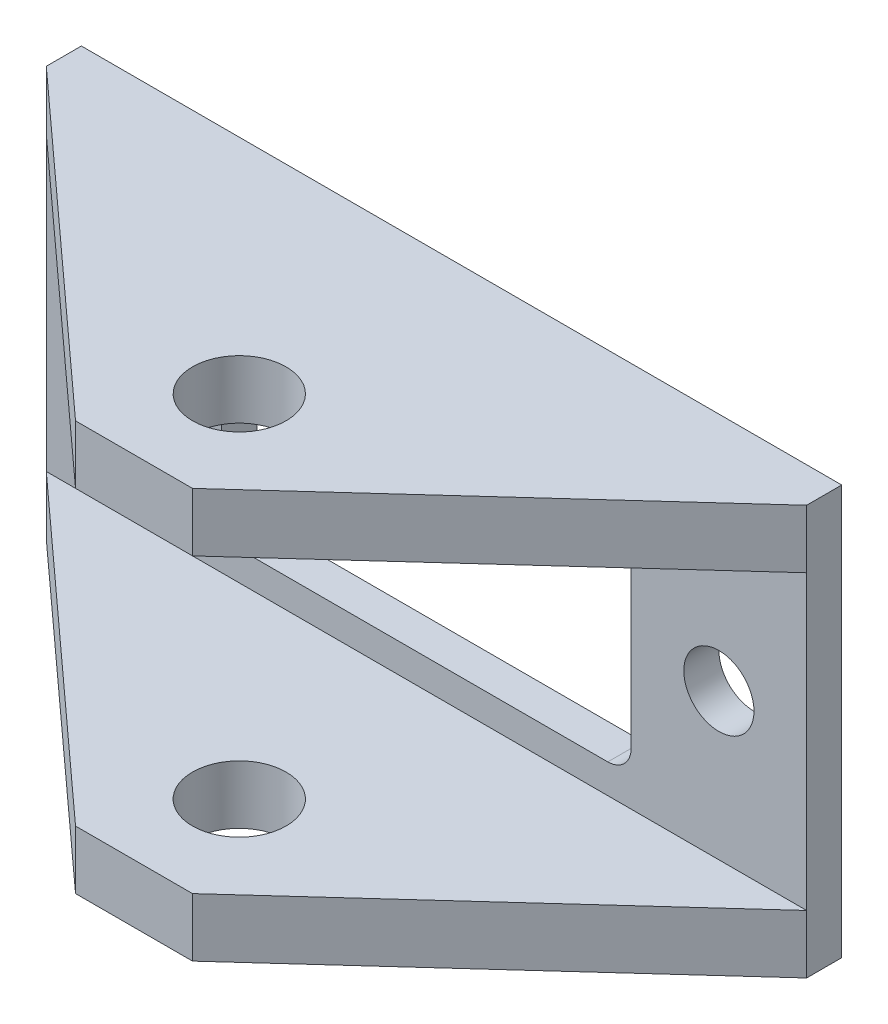
ISO-10303-21;
HEADER;
FILE_DESCRIPTION(('STEP AP214'),'2;1');
FILE_NAME('part.step','',(''),(''),'','','');
FILE_SCHEMA(('AUTOMOTIVE_DESIGN { 1 0 10303 214 1 1 1 1 }'));
ENDSEC;
DATA;
#1=APPLICATION_CONTEXT('core data for automotive mechanical design processes');
#2=APPLICATION_PROTOCOL_DEFINITION('international standard','automotive_design',2000,#1);
#3=PRODUCT_CONTEXT('',#1,'mechanical');
#4=PRODUCT('Part','Part','',(#3));
#5=PRODUCT_RELATED_PRODUCT_CATEGORY('part','',(#4));
#6=PRODUCT_DEFINITION_FORMATION('','',#4);
#7=PRODUCT_DEFINITION_CONTEXT('part definition',#1,'design');
#8=PRODUCT_DEFINITION('design','',#6,#7);
#9=PRODUCT_DEFINITION_SHAPE('','',#8);
#10=(LENGTH_UNIT() NAMED_UNIT(*) SI_UNIT(.MILLI.,.METRE.));
#11=(NAMED_UNIT(*) PLANE_ANGLE_UNIT() SI_UNIT($,.RADIAN.));
#12=(NAMED_UNIT(*) SI_UNIT($,.STERADIAN.) SOLID_ANGLE_UNIT());
#13=UNCERTAINTY_MEASURE_WITH_UNIT(LENGTH_MEASURE(1.E-05),#10,'distance_accuracy_value','');
#14=(GEOMETRIC_REPRESENTATION_CONTEXT(3) GLOBAL_UNCERTAINTY_ASSIGNED_CONTEXT((#13)) GLOBAL_UNIT_ASSIGNED_CONTEXT((#10,
#11,#12)) REPRESENTATION_CONTEXT('',''));
#15=CARTESIAN_POINT('',(0.,0.,0.));
#16=DIRECTION('',(0.,0.,1.));
#17=DIRECTION('',(1.,0.,0.));
#18=AXIS2_PLACEMENT_3D('',#15,#16,#17);
#19=CARTESIAN_POINT('',(0.,35.,-12.5));
#20=DIRECTION('',(0.,0.,-1.));
#21=DIRECTION('',(-1.,0.,0.));
#22=AXIS2_PLACEMENT_3D('',#19,#20,#21);
#23=PLANE('',#22);
#24=CARTESIAN_POINT('',(-25.,17.5,-12.5));
#25=DIRECTION('',(0.,0.,1.));
#26=DIRECTION('',(1.,0.,0.));
#27=AXIS2_PLACEMENT_3D('',#24,#25,#26);
#28=CIRCLE('',#27,3.);
#29=CARTESIAN_POINT('',(-22.,17.5,-12.5));
#30=VERTEX_POINT('',#29);
#31=EDGE_CURVE('E609',#30,#30,#28,.T.);
#32=ORIENTED_EDGE('',*,*,#31,.T.);
#33=EDGE_LOOP('',(#32));
#34=FACE_BOUND('',#33,.T.);
#35=CARTESIAN_POINT('',(25.,17.5,-12.5));
#36=DIRECTION('',(0.,0.,1.));
#37=DIRECTION('',(1.,0.,0.));
#38=AXIS2_PLACEMENT_3D('',#35,#36,#37);
#39=CIRCLE('',#38,3.);
#40=CARTESIAN_POINT('',(28.,17.5,-12.5));
#41=VERTEX_POINT('',#40);
#42=EDGE_CURVE('E608',#41,#41,#39,.T.);
#43=ORIENTED_EDGE('',*,*,#42,.T.);
#44=EDGE_LOOP('',(#43));
#45=FACE_BOUND('',#44,.T.);
#46=DIRECTION('',(1.,0.,0.));
#47=VECTOR('',#46,1.);
#48=CARTESIAN_POINT('',(0.,0.,-12.5));
#49=LINE('',#48,#47);
#50=CARTESIAN_POINT('',(-32.5,0.,-12.5));
#51=VERTEX_POINT('',#50);
#52=CARTESIAN_POINT('',(32.5,0.,-12.5));
#53=VERTEX_POINT('',#52);
#54=EDGE_CURVE('E381',#51,#53,#49,.T.);
#55=ORIENTED_EDGE('',*,*,#54,.F.);
#56=DIRECTION('',(0.,-1.,0.));
#57=VECTOR('',#56,1.);
#58=CARTESIAN_POINT('',(-32.5,35.,-12.5));
#59=LINE('',#58,#57);
#60=CARTESIAN_POINT('',(-32.5,35.,-12.5));
#61=VERTEX_POINT('',#60);
#62=EDGE_CURVE('E388',#61,#51,#59,.T.);
#63=ORIENTED_EDGE('',*,*,#62,.F.);
#64=DIRECTION('',(1.,0.,0.));
#65=VECTOR('',#64,1.);
#66=CARTESIAN_POINT('',(0.,35.,-12.5));
#67=LINE('',#66,#65);
#68=CARTESIAN_POINT('',(32.5,35.,-12.5));
#69=VERTEX_POINT('',#68);
#70=EDGE_CURVE('E364',#61,#69,#67,.T.);
#71=ORIENTED_EDGE('',*,*,#70,.T.);
#72=DIRECTION('',(0.,-1.,0.));
#73=VECTOR('',#72,1.);
#74=CARTESIAN_POINT('',(32.5,35.,-12.5));
#75=LINE('',#74,#73);
#76=EDGE_CURVE('E204',#69,#53,#75,.T.);
#77=ORIENTED_EDGE('',*,*,#76,.T.);
#78=EDGE_LOOP('',(#55,#63,#71,#77));
#79=FACE_BOUND('',#78,.T.);
#80=DIRECTION('',(0.,-1.,0.));
#81=VECTOR('',#80,1.);
#82=CARTESIAN_POINT('',(-17.5,0.,-12.5));
#83=LINE('',#82,#81);
#84=CARTESIAN_POINT('',(-17.5,25.5,-12.5));
#85=VERTEX_POINT('',#84);
#86=CARTESIAN_POINT('',(-17.5,9.5,-12.5));
#87=VERTEX_POINT('',#86);
#88=EDGE_CURVE('E279',#85,#87,#83,.T.);
#89=ORIENTED_EDGE('',*,*,#88,.T.);
#90=CARTESIAN_POINT('',(-15.5,9.5,-12.5));
#91=DIRECTION('',(0.,0.,-1.));
#92=DIRECTION('',(-1.,0.,0.));
#93=AXIS2_PLACEMENT_3D('',#90,#91,#92);
#94=CIRCLE('',#93,2.);
#95=CARTESIAN_POINT('',(-15.5,7.5,-12.5));
#96=VERTEX_POINT('',#95);
#97=EDGE_CURVE('E258',#87,#96,#94,.F.);
#98=ORIENTED_EDGE('',*,*,#97,.T.);
#99=DIRECTION('',(1.,0.,0.));
#100=VECTOR('',#99,1.);
#101=CARTESIAN_POINT('',(0.,7.5,-12.5));
#102=LINE('',#101,#100);
#103=CARTESIAN_POINT('',(15.5,7.5,-12.5));
#104=VERTEX_POINT('',#103);
#105=EDGE_CURVE('E229',#96,#104,#102,.T.);
#106=ORIENTED_EDGE('',*,*,#105,.T.);
#107=CARTESIAN_POINT('',(15.5,9.5,-12.5));
#108=DIRECTION('',(0.,0.,-1.));
#109=DIRECTION('',(-1.,0.,0.));
#110=AXIS2_PLACEMENT_3D('',#107,#108,#109);
#111=CIRCLE('',#110,2.);
#112=CARTESIAN_POINT('',(17.5,9.5,-12.5));
#113=VERTEX_POINT('',#112);
#114=EDGE_CURVE('E262',#104,#113,#111,.F.);
#115=ORIENTED_EDGE('',*,*,#114,.T.);
#116=DIRECTION('',(0.,-1.,0.));
#117=VECTOR('',#116,1.);
#118=CARTESIAN_POINT('',(17.5,0.,-12.5));
#119=LINE('',#118,#117);
#120=CARTESIAN_POINT('',(17.5,25.5,-12.5));
#121=VERTEX_POINT('',#120);
#122=EDGE_CURVE('E275',#121,#113,#119,.T.);
#123=ORIENTED_EDGE('',*,*,#122,.F.);
#124=CARTESIAN_POINT('',(15.5,25.5,-12.5));
#125=DIRECTION('',(0.,0.,-1.));
#126=DIRECTION('',(-1.,0.,0.));
#127=AXIS2_PLACEMENT_3D('',#124,#125,#126);
#128=CIRCLE('',#127,2.);
#129=CARTESIAN_POINT('',(15.5,27.5,-12.5));
#130=VERTEX_POINT('',#129);
#131=EDGE_CURVE('E265',#121,#130,#128,.F.);
#132=ORIENTED_EDGE('',*,*,#131,.T.);
#133=DIRECTION('',(1.,0.,0.));
#134=VECTOR('',#133,1.);
#135=CARTESIAN_POINT('',(0.,27.5,-12.5));
#136=LINE('',#135,#134);
#137=CARTESIAN_POINT('',(-15.5,27.5,-12.5));
#138=VERTEX_POINT('',#137);
#139=EDGE_CURVE('E272',#138,#130,#136,.T.);
#140=ORIENTED_EDGE('',*,*,#139,.F.);
#141=CARTESIAN_POINT('',(-15.5,25.5,-12.5));
#142=DIRECTION('',(0.,0.,-1.));
#143=DIRECTION('',(-1.,0.,0.));
#144=AXIS2_PLACEMENT_3D('',#141,#142,#143);
#145=CIRCLE('',#144,2.);
#146=EDGE_CURVE('E11',#138,#85,#145,.F.);
#147=ORIENTED_EDGE('',*,*,#146,.T.);
#148=EDGE_LOOP('',(#89,#98,#106,#115,#123,#132,#140,#147));
#149=FACE_BOUND('',#148,.T.);
#150=ADVANCED_FACE('F37',(#34,#45,#79,#149),#23,.T.);
#151=CARTESIAN_POINT('',(0.,0.,-9.5));
#152=DIRECTION('',(0.,0.,1.));
#153=DIRECTION('',(1.,0.,0.));
#154=AXIS2_PLACEMENT_3D('',#151,#152,#153);
#155=PLANE('',#154);
#156=CARTESIAN_POINT('',(-25.,17.5,-9.5));
#157=DIRECTION('',(0.,0.,1.));
#158=DIRECTION('',(1.,0.,0.));
#159=AXIS2_PLACEMENT_3D('',#156,#157,#158);
#160=CIRCLE('',#159,3.);
#161=CARTESIAN_POINT('',(-22.,17.5,-9.5));
#162=VERTEX_POINT('',#161);
#163=EDGE_CURVE('E228',#162,#162,#160,.T.);
#164=ORIENTED_EDGE('',*,*,#163,.F.);
#165=EDGE_LOOP('',(#164));
#166=FACE_BOUND('',#165,.T.);
#167=CARTESIAN_POINT('',(25.,17.5,-9.5));
#168=DIRECTION('',(0.,0.,1.));
#169=DIRECTION('',(1.,0.,0.));
#170=AXIS2_PLACEMENT_3D('',#167,#168,#169);
#171=CIRCLE('',#170,3.);
#172=CARTESIAN_POINT('',(28.,17.5,-9.5));
#173=VERTEX_POINT('',#172);
#174=EDGE_CURVE('E225',#173,#173,#171,.T.);
#175=ORIENTED_EDGE('',*,*,#174,.F.);
#176=EDGE_LOOP('',(#175));
#177=FACE_BOUND('',#176,.T.);
#178=DIRECTION('',(0.,-1.,0.));
#179=VECTOR('',#178,1.);
#180=CARTESIAN_POINT('',(32.5,0.,-9.5));
#181=LINE('',#180,#179);
#182=CARTESIAN_POINT('',(32.5,30.,-9.5));
#183=VERTEX_POINT('',#182);
#184=CARTESIAN_POINT('',(32.5,5.,-9.5));
#185=VERTEX_POINT('',#184);
#186=EDGE_CURVE('E172',#183,#185,#181,.T.);
#187=ORIENTED_EDGE('',*,*,#186,.F.);
#188=DIRECTION('',(1.,0.,0.));
#189=VECTOR('',#188,1.);
#190=CARTESIAN_POINT('',(0.,30.,-9.5));
#191=LINE('',#190,#189);
#192=CARTESIAN_POINT('',(-32.5,30.,-9.5));
#193=VERTEX_POINT('',#192);
#194=EDGE_CURVE('E161',#193,#183,#191,.T.);
#195=ORIENTED_EDGE('',*,*,#194,.F.);
#196=DIRECTION('',(0.,-1.,0.));
#197=VECTOR('',#196,1.);
#198=CARTESIAN_POINT('',(-32.5,0.,-9.5));
#199=LINE('',#198,#197);
#200=CARTESIAN_POINT('',(-32.5,5.,-9.5));
#201=VERTEX_POINT('',#200);
#202=EDGE_CURVE('E171',#193,#201,#199,.T.);
#203=ORIENTED_EDGE('',*,*,#202,.T.);
#204=DIRECTION('',(1.,0.,0.));
#205=VECTOR('',#204,1.);
#206=CARTESIAN_POINT('',(0.,5.,-9.5));
#207=LINE('',#206,#205);
#208=EDGE_CURVE('E178',#201,#185,#207,.T.);
#209=ORIENTED_EDGE('',*,*,#208,.T.);
#210=EDGE_LOOP('',(#187,#195,#203,#209));
#211=FACE_BOUND('',#210,.T.);
#212=DIRECTION('',(0.,-1.,0.));
#213=VECTOR('',#212,1.);
#214=CARTESIAN_POINT('',(-17.5,0.,-9.5));
#215=LINE('',#214,#213);
#216=CARTESIAN_POINT('',(-17.5,25.5,-9.5));
#217=VERTEX_POINT('',#216);
#218=CARTESIAN_POINT('',(-17.5,9.5,-9.5));
#219=VERTEX_POINT('',#218);
#220=EDGE_CURVE('E215',#217,#219,#215,.T.);
#221=ORIENTED_EDGE('',*,*,#220,.F.);
#222=CARTESIAN_POINT('',(-15.5,25.5,-9.5));
#223=DIRECTION('',(0.,0.,1.));
#224=DIRECTION('',(1.,0.,0.));
#225=AXIS2_PLACEMENT_3D('',#222,#223,#224);
#226=CIRCLE('',#225,2.);
#227=CARTESIAN_POINT('',(-15.5,27.5,-9.5));
#228=VERTEX_POINT('',#227);
#229=EDGE_CURVE('E45',#217,#228,#226,.F.);
#230=ORIENTED_EDGE('',*,*,#229,.T.);
#231=DIRECTION('',(1.,0.,0.));
#232=VECTOR('',#231,1.);
#233=CARTESIAN_POINT('',(0.,27.5,-9.5));
#234=LINE('',#233,#232);
#235=CARTESIAN_POINT('',(15.5,27.5,-9.5));
#236=VERTEX_POINT('',#235);
#237=EDGE_CURVE('E213',#228,#236,#234,.T.);
#238=ORIENTED_EDGE('',*,*,#237,.T.);
#239=CARTESIAN_POINT('',(15.5,25.5,-9.5));
#240=DIRECTION('',(0.,0.,1.));
#241=DIRECTION('',(1.,0.,0.));
#242=AXIS2_PLACEMENT_3D('',#239,#240,#241);
#243=CIRCLE('',#242,2.);
#244=CARTESIAN_POINT('',(17.5,25.5,-9.5));
#245=VERTEX_POINT('',#244);
#246=EDGE_CURVE('E52',#236,#245,#243,.F.);
#247=ORIENTED_EDGE('',*,*,#246,.T.);
#248=DIRECTION('',(0.,-1.,0.));
#249=VECTOR('',#248,1.);
#250=CARTESIAN_POINT('',(17.5,0.,-9.5));
#251=LINE('',#250,#249);
#252=CARTESIAN_POINT('',(17.5,9.5,-9.5));
#253=VERTEX_POINT('',#252);
#254=EDGE_CURVE('E221',#245,#253,#251,.T.);
#255=ORIENTED_EDGE('',*,*,#254,.T.);
#256=CARTESIAN_POINT('',(15.5,9.5,-9.5));
#257=DIRECTION('',(0.,0.,1.));
#258=DIRECTION('',(1.,0.,0.));
#259=AXIS2_PLACEMENT_3D('',#256,#257,#258);
#260=CIRCLE('',#259,2.);
#261=CARTESIAN_POINT('',(15.5,7.5,-9.5));
#262=VERTEX_POINT('',#261);
#263=EDGE_CURVE('E260',#253,#262,#260,.F.);
#264=ORIENTED_EDGE('',*,*,#263,.T.);
#265=DIRECTION('',(1.,0.,0.));
#266=VECTOR('',#265,1.);
#267=CARTESIAN_POINT('',(0.,7.5,-9.5));
#268=LINE('',#267,#266);
#269=CARTESIAN_POINT('',(-15.5,7.5,-9.5));
#270=VERTEX_POINT('',#269);
#271=EDGE_CURVE('E218',#270,#262,#268,.T.);
#272=ORIENTED_EDGE('',*,*,#271,.F.);
#273=CARTESIAN_POINT('',(-15.5,9.5,-9.5));
#274=DIRECTION('',(0.,0.,1.));
#275=DIRECTION('',(1.,0.,0.));
#276=AXIS2_PLACEMENT_3D('',#273,#274,#275);
#277=CIRCLE('',#276,2.);
#278=EDGE_CURVE('E256',#270,#219,#277,.F.);
#279=ORIENTED_EDGE('',*,*,#278,.T.);
#280=EDGE_LOOP('',(#221,#230,#238,#247,#255,#264,#272,#279));
#281=FACE_BOUND('',#280,.T.);
#282=ADVANCED_FACE('F176',(#166,#177,#211,#281),#155,.T.);
#283=CARTESIAN_POINT('',(-9.97737556561085,35.,10.9751131221719));
#284=DIRECTION('',(0.672672793996312,0.,-0.739940073395944));
#285=DIRECTION('',(-0.739940073395944,0.,-0.672672793996312));
#286=AXIS2_PLACEMENT_3D('',#283,#284,#285);
#287=PLANE('',#286);
#288=DIRECTION('',(-0.739940073395944,0.,-0.672672793996312));
#289=VECTOR('',#288,1.);
#290=CARTESIAN_POINT('',(-9.97737556561085,30.,10.9751131221719));
#291=LINE('',#290,#289);
#292=CARTESIAN_POINT('',(-5.,30.,15.5));
#293=VERTEX_POINT('',#292);
#294=EDGE_CURVE('E168',#293,#193,#291,.T.);
#295=ORIENTED_EDGE('',*,*,#294,.F.);
#296=DIRECTION('',(0.,-1.,0.));
#297=VECTOR('',#296,1.);
#298=CARTESIAN_POINT('',(-5.,35.,15.5));
#299=LINE('',#298,#297);
#300=CARTESIAN_POINT('',(-5.,35.,15.5));
#301=VERTEX_POINT('',#300);
#302=EDGE_CURVE('E194',#301,#293,#299,.T.);
#303=ORIENTED_EDGE('',*,*,#302,.F.);
#304=DIRECTION('',(0.739940073395944,0.,0.672672793996312));
#305=VECTOR('',#304,1.);
#306=CARTESIAN_POINT('',(-9.97737556561085,35.,10.9751131221719));
#307=LINE('',#306,#305);
#308=CARTESIAN_POINT('',(-32.5,35.,-9.5));
#309=VERTEX_POINT('',#308);
#310=EDGE_CURVE('E355',#309,#301,#307,.T.);
#311=ORIENTED_EDGE('',*,*,#310,.F.);
#312=DIRECTION('',(0.,-1.,0.));
#313=VECTOR('',#312,1.);
#314=CARTESIAN_POINT('',(-32.5,35.,-9.5));
#315=LINE('',#314,#313);
#316=EDGE_CURVE('E386',#309,#193,#315,.T.);
#317=ORIENTED_EDGE('',*,*,#316,.T.);
#318=EDGE_LOOP('',(#295,#303,#311,#317));
#319=FACE_BOUND('',#318,.T.);
#320=ADVANCED_FACE('F298',(#319),#287,.F.);
#321=CARTESIAN_POINT('',(0.,35.,15.5));
#322=DIRECTION('',(0.,0.,-1.));
#323=DIRECTION('',(-1.,0.,0.));
#324=AXIS2_PLACEMENT_3D('',#321,#322,#323);
#325=PLANE('',#324);
#326=DIRECTION('',(-1.,0.,0.));
#327=VECTOR('',#326,1.);
#328=CARTESIAN_POINT('',(0.,30.,15.5));
#329=LINE('',#328,#327);
#330=CARTESIAN_POINT('',(5.,30.,15.5));
#331=VERTEX_POINT('',#330);
#332=EDGE_CURVE('E182',#331,#293,#329,.T.);
#333=ORIENTED_EDGE('',*,*,#332,.F.);
#334=DIRECTION('',(0.,-1.,0.));
#335=VECTOR('',#334,1.);
#336=CARTESIAN_POINT('',(5.,35.,15.5));
#337=LINE('',#336,#335);
#338=CARTESIAN_POINT('',(5.,35.,15.5));
#339=VERTEX_POINT('',#338);
#340=EDGE_CURVE('E192',#339,#331,#337,.T.);
#341=ORIENTED_EDGE('',*,*,#340,.F.);
#342=DIRECTION('',(1.,0.,0.));
#343=VECTOR('',#342,1.);
#344=CARTESIAN_POINT('',(0.,35.,15.5));
#345=LINE('',#344,#343);
#346=EDGE_CURVE('E358',#301,#339,#345,.T.);
#347=ORIENTED_EDGE('',*,*,#346,.F.);
#348=ORIENTED_EDGE('',*,*,#302,.T.);
#349=EDGE_LOOP('',(#333,#341,#347,#348));
#350=FACE_BOUND('',#349,.T.);
#351=ADVANCED_FACE('F318',(#350),#325,.F.);
#352=CARTESIAN_POINT('',(9.97737556561086,35.,10.9751131221719));
#353=DIRECTION('',(-0.672672793996312,0.,-0.739940073395944));
#354=DIRECTION('',(-0.739940073395944,0.,0.672672793996313));
#355=AXIS2_PLACEMENT_3D('',#352,#353,#354);
#356=PLANE('',#355);
#357=DIRECTION('',(-0.739940073395944,0.,0.672672793996313));
#358=VECTOR('',#357,1.);
#359=CARTESIAN_POINT('',(9.97737556561086,30.,10.9751131221719));
#360=LINE('',#359,#358);
#361=EDGE_CURVE('E165',#183,#331,#360,.T.);
#362=ORIENTED_EDGE('',*,*,#361,.F.);
#363=DIRECTION('',(0.,-1.,0.));
#364=VECTOR('',#363,1.);
#365=CARTESIAN_POINT('',(32.5,35.,-9.5));
#366=LINE('',#365,#364);
#367=CARTESIAN_POINT('',(32.5,35.,-9.5));
#368=VERTEX_POINT('',#367);
#369=EDGE_CURVE('E189',#368,#183,#366,.T.);
#370=ORIENTED_EDGE('',*,*,#369,.F.);
#371=DIRECTION('',(0.739940073395944,0.,-0.672672793996313));
#372=VECTOR('',#371,1.);
#373=CARTESIAN_POINT('',(9.97737556561086,35.,10.9751131221719));
#374=LINE('',#373,#372);
#375=EDGE_CURVE('E361',#339,#368,#374,.T.);
#376=ORIENTED_EDGE('',*,*,#375,.F.);
#377=ORIENTED_EDGE('',*,*,#340,.T.);
#378=EDGE_LOOP('',(#362,#370,#376,#377));
#379=FACE_BOUND('',#378,.T.);
#380=ADVANCED_FACE('F187',(#379),#356,.F.);
#381=CARTESIAN_POINT('',(-5.,5.,15.5));
#382=VERTEX_POINT('',#381);
#383=CARTESIAN_POINT('',(-5.,0.,15.5));
#384=VERTEX_POINT('',#383);
#385=EDGE_CURVE('E208',#382,#384,#299,.T.);
#386=ORIENTED_EDGE('',*,*,#385,.F.);
#387=DIRECTION('',(-0.739940073395944,0.,-0.672672793996312));
#388=VECTOR('',#387,1.);
#389=CARTESIAN_POINT('',(-9.97737556561085,5.,10.9751131221719));
#390=LINE('',#389,#388);
#391=EDGE_CURVE('E351',#382,#201,#390,.T.);
#392=ORIENTED_EDGE('',*,*,#391,.T.);
#393=CARTESIAN_POINT('',(-32.5,0.,-9.5));
#394=VERTEX_POINT('',#393);
#395=EDGE_CURVE('E369',#201,#394,#315,.T.);
#396=ORIENTED_EDGE('',*,*,#395,.T.);
#397=DIRECTION('',(0.739940073395944,0.,0.672672793996312));
#398=VECTOR('',#397,1.);
#399=CARTESIAN_POINT('',(-9.97737556561085,0.,10.9751131221719));
#400=LINE('',#399,#398);
#401=EDGE_CURVE('E354',#394,#384,#400,.T.);
#402=ORIENTED_EDGE('',*,*,#401,.T.);
#403=EDGE_LOOP('',(#386,#392,#396,#402));
#404=FACE_BOUND('',#403,.T.);
#405=ADVANCED_FACE('F316',(#404),#287,.F.);
#406=CARTESIAN_POINT('',(5.,5.,15.5));
#407=VERTEX_POINT('',#406);
#408=CARTESIAN_POINT('',(5.,0.,15.5));
#409=VERTEX_POINT('',#408);
#410=EDGE_CURVE('E200',#407,#409,#337,.T.);
#411=ORIENTED_EDGE('',*,*,#410,.F.);
#412=DIRECTION('',(-1.,0.,0.));
#413=VECTOR('',#412,1.);
#414=CARTESIAN_POINT('',(0.,5.,15.5));
#415=LINE('',#414,#413);
#416=EDGE_CURVE('E232',#407,#382,#415,.T.);
#417=ORIENTED_EDGE('',*,*,#416,.T.);
#418=ORIENTED_EDGE('',*,*,#385,.T.);
#419=DIRECTION('',(1.,0.,0.));
#420=VECTOR('',#419,1.);
#421=CARTESIAN_POINT('',(0.,0.,15.5));
#422=LINE('',#421,#420);
#423=EDGE_CURVE('E372',#384,#409,#422,.T.);
#424=ORIENTED_EDGE('',*,*,#423,.T.);
#425=EDGE_LOOP('',(#411,#417,#418,#424));
#426=FACE_BOUND('',#425,.T.);
#427=ADVANCED_FACE('F312',(#426),#325,.F.);
#428=CARTESIAN_POINT('',(32.5,0.,-9.5));
#429=VERTEX_POINT('',#428);
#430=EDGE_CURVE('E201',#185,#429,#366,.T.);
#431=ORIENTED_EDGE('',*,*,#430,.F.);
#432=DIRECTION('',(-0.739940073395944,0.,0.672672793996313));
#433=VECTOR('',#432,1.);
#434=CARTESIAN_POINT('',(9.97737556561086,5.,10.9751131221719));
#435=LINE('',#434,#433);
#436=EDGE_CURVE('E193',#185,#407,#435,.T.);
#437=ORIENTED_EDGE('',*,*,#436,.T.);
#438=ORIENTED_EDGE('',*,*,#410,.T.);
#439=DIRECTION('',(0.739940073395944,0.,-0.672672793996313));
#440=VECTOR('',#439,1.);
#441=CARTESIAN_POINT('',(9.97737556561086,0.,10.9751131221719));
#442=LINE('',#441,#440);
#443=EDGE_CURVE('E375',#409,#429,#442,.T.);
#444=ORIENTED_EDGE('',*,*,#443,.T.);
#445=EDGE_LOOP('',(#431,#437,#438,#444));
#446=FACE_BOUND('',#445,.T.);
#447=ADVANCED_FACE('F309',(#446),#356,.F.);
#448=CARTESIAN_POINT('',(32.5,35.,-1.50342701251323E-13));
#449=DIRECTION('',(1.,0.,0.));
#450=DIRECTION('',(0.,0.,-1.));
#451=AXIS2_PLACEMENT_3D('',#448,#449,#450);
#452=PLANE('',#451);
#453=DIRECTION('',(0.,0.,1.));
#454=VECTOR('',#453,1.);
#455=CARTESIAN_POINT('',(32.5,0.,-1.50342701251323E-13));
#456=LINE('',#455,#454);
#457=EDGE_CURVE('E378',#53,#429,#456,.T.);
#458=ORIENTED_EDGE('',*,*,#457,.F.);
#459=ORIENTED_EDGE('',*,*,#76,.F.);
#460=DIRECTION('',(0.,0.,1.));
#461=VECTOR('',#460,1.);
#462=CARTESIAN_POINT('',(32.5,35.,-1.50342701251323E-13));
#463=LINE('',#462,#461);
#464=EDGE_CURVE('E199',#69,#368,#463,.T.);
#465=ORIENTED_EDGE('',*,*,#464,.T.);
#466=ORIENTED_EDGE('',*,*,#369,.T.);
#467=ORIENTED_EDGE('',*,*,#186,.T.);
#468=ORIENTED_EDGE('',*,*,#430,.T.);
#469=EDGE_LOOP('',(#458,#459,#465,#466,#467,#468));
#470=FACE_BOUND('',#469,.T.);
#471=ADVANCED_FACE('F197',(#470),#452,.T.);
#472=CARTESIAN_POINT('',(-32.5,35.,0.));
#473=DIRECTION('',(1.,0.,0.));
#474=DIRECTION('',(0.,0.,-1.));
#475=AXIS2_PLACEMENT_3D('',#472,#473,#474);
#476=PLANE('',#475);
#477=DIRECTION('',(0.,0.,1.));
#478=VECTOR('',#477,1.);
#479=CARTESIAN_POINT('',(-32.5,0.,0.));
#480=LINE('',#479,#478);
#481=EDGE_CURVE('E359',#51,#394,#480,.T.);
#482=ORIENTED_EDGE('',*,*,#481,.T.);
#483=ORIENTED_EDGE('',*,*,#395,.F.);
#484=ORIENTED_EDGE('',*,*,#202,.F.);
#485=ORIENTED_EDGE('',*,*,#316,.F.);
#486=DIRECTION('',(0.,0.,1.));
#487=VECTOR('',#486,1.);
#488=CARTESIAN_POINT('',(-32.5,35.,0.));
#489=LINE('',#488,#487);
#490=EDGE_CURVE('E367',#61,#309,#489,.T.);
#491=ORIENTED_EDGE('',*,*,#490,.F.);
#492=ORIENTED_EDGE('',*,*,#62,.T.);
#493=EDGE_LOOP('',(#482,#483,#484,#485,#491,#492));
#494=FACE_BOUND('',#493,.T.);
#495=ADVANCED_FACE('F305',(#494),#476,.F.);
#496=CARTESIAN_POINT('',(0.,35.,0.));
#497=DIRECTION('',(0.,1.,0.));
#498=DIRECTION('',(0.,0.,1.));
#499=AXIS2_PLACEMENT_3D('',#496,#497,#498);
#500=PLANE('',#499);
#501=CARTESIAN_POINT('',(0.,35.,6.5));
#502=DIRECTION('',(0.,1.,0.));
#503=DIRECTION('',(0.,0.,1.));
#504=AXIS2_PLACEMENT_3D('',#501,#502,#503);
#505=CIRCLE('',#504,4.);
#506=CARTESIAN_POINT('',(0.,35.,10.5));
#507=VERTEX_POINT('',#506);
#508=EDGE_CURVE('E429',#507,#507,#505,.T.);
#509=ORIENTED_EDGE('',*,*,#508,.F.);
#510=EDGE_LOOP('',(#509));
#511=FACE_BOUND('',#510,.T.);
#512=ORIENTED_EDGE('',*,*,#310,.T.);
#513=ORIENTED_EDGE('',*,*,#346,.T.);
#514=ORIENTED_EDGE('',*,*,#375,.T.);
#515=ORIENTED_EDGE('',*,*,#464,.F.);
#516=ORIENTED_EDGE('',*,*,#70,.F.);
#517=ORIENTED_EDGE('',*,*,#490,.T.);
#518=EDGE_LOOP('',(#512,#513,#514,#515,#516,#517));
#519=FACE_BOUND('',#518,.T.);
#520=ADVANCED_FACE('F416',(#511,#519),#500,.T.);
#521=CARTESIAN_POINT('',(0.,0.,0.));
#522=DIRECTION('',(0.,1.,0.));
#523=DIRECTION('',(0.,0.,1.));
#524=AXIS2_PLACEMENT_3D('',#521,#522,#523);
#525=PLANE('',#524);
#526=CARTESIAN_POINT('',(0.,0.,6.5));
#527=DIRECTION('',(0.,1.,0.));
#528=DIRECTION('',(0.,0.,1.));
#529=AXIS2_PLACEMENT_3D('',#526,#527,#528);
#530=CIRCLE('',#529,4.);
#531=CARTESIAN_POINT('',(0.,0.,10.5));
#532=VERTEX_POINT('',#531);
#533=EDGE_CURVE('E237',#532,#532,#530,.T.);
#534=ORIENTED_EDGE('',*,*,#533,.T.);
#535=EDGE_LOOP('',(#534));
#536=FACE_BOUND('',#535,.T.);
#537=ORIENTED_EDGE('',*,*,#401,.F.);
#538=ORIENTED_EDGE('',*,*,#481,.F.);
#539=ORIENTED_EDGE('',*,*,#54,.T.);
#540=ORIENTED_EDGE('',*,*,#457,.T.);
#541=ORIENTED_EDGE('',*,*,#443,.F.);
#542=ORIENTED_EDGE('',*,*,#423,.F.);
#543=EDGE_LOOP('',(#537,#538,#539,#540,#541,#542));
#544=FACE_BOUND('',#543,.T.);
#545=ADVANCED_FACE('F398',(#536,#544),#525,.F.);
#546=CARTESIAN_POINT('',(0.,5.,-9.5));
#547=DIRECTION('',(0.,-1.,0.));
#548=DIRECTION('',(0.,0.,-1.));
#549=AXIS2_PLACEMENT_3D('',#546,#547,#548);
#550=PLANE('',#549);
#551=CARTESIAN_POINT('',(0.,5.,6.5));
#552=DIRECTION('',(0.,-1.,0.));
#553=DIRECTION('',(0.,0.,-1.));
#554=AXIS2_PLACEMENT_3D('',#551,#552,#553);
#555=CIRCLE('',#554,4.);
#556=CARTESIAN_POINT('',(0.,5.,2.5));
#557=VERTEX_POINT('',#556);
#558=EDGE_CURVE('E236',#557,#557,#555,.T.);
#559=ORIENTED_EDGE('',*,*,#558,.T.);
#560=EDGE_LOOP('',(#559));
#561=FACE_BOUND('',#560,.T.);
#562=ORIENTED_EDGE('',*,*,#416,.F.);
#563=ORIENTED_EDGE('',*,*,#436,.F.);
#564=ORIENTED_EDGE('',*,*,#208,.F.);
#565=ORIENTED_EDGE('',*,*,#391,.F.);
#566=EDGE_LOOP('',(#562,#563,#564,#565));
#567=FACE_BOUND('',#566,.T.);
#568=ADVANCED_FACE('F404',(#561,#567),#550,.F.);
#569=CARTESIAN_POINT('',(0.,30.,-9.5));
#570=DIRECTION('',(0.,-1.,0.));
#571=DIRECTION('',(0.,0.,-1.));
#572=AXIS2_PLACEMENT_3D('',#569,#570,#571);
#573=PLANE('',#572);
#574=CARTESIAN_POINT('',(0.,30.,6.5));
#575=DIRECTION('',(0.,-1.,0.));
#576=DIRECTION('',(0.,0.,-1.));
#577=AXIS2_PLACEMENT_3D('',#574,#575,#576);
#578=CIRCLE('',#577,4.);
#579=CARTESIAN_POINT('',(0.,30.,2.5));
#580=VERTEX_POINT('',#579);
#581=EDGE_CURVE('E233',#580,#580,#578,.T.);
#582=ORIENTED_EDGE('',*,*,#581,.F.);
#583=EDGE_LOOP('',(#582));
#584=FACE_BOUND('',#583,.T.);
#585=ORIENTED_EDGE('',*,*,#294,.T.);
#586=ORIENTED_EDGE('',*,*,#194,.T.);
#587=ORIENTED_EDGE('',*,*,#361,.T.);
#588=ORIENTED_EDGE('',*,*,#332,.T.);
#589=EDGE_LOOP('',(#585,#586,#587,#588));
#590=FACE_BOUND('',#589,.T.);
#591=ADVANCED_FACE('F163',(#584,#590),#573,.T.);
#592=CARTESIAN_POINT('',(17.5,0.,-12.5));
#593=DIRECTION('',(-1.,0.,0.));
#594=DIRECTION('',(0.,-1.,0.));
#595=AXIS2_PLACEMENT_3D('',#592,#593,#594);
#596=PLANE('',#595);
#597=ORIENTED_EDGE('',*,*,#122,.T.);
#598=DIRECTION('',(0.,0.,1.));
#599=VECTOR('',#598,1.);
#600=CARTESIAN_POINT('',(17.5,9.5,-12.5));
#601=LINE('',#600,#599);
#602=EDGE_CURVE('E249',#113,#253,#601,.T.);
#603=ORIENTED_EDGE('',*,*,#602,.T.);
#604=ORIENTED_EDGE('',*,*,#254,.F.);
#605=DIRECTION('',(0.,0.,1.));
#606=VECTOR('',#605,1.);
#607=CARTESIAN_POINT('',(17.5,25.5,-12.5));
#608=LINE('',#607,#606);
#609=EDGE_CURVE('E247',#245,#121,#608,.F.);
#610=ORIENTED_EDGE('',*,*,#609,.T.);
#611=EDGE_LOOP('',(#597,#603,#604,#610));
#612=FACE_BOUND('',#611,.T.);
#613=ADVANCED_FACE('F413',(#612),#596,.T.);
#614=CARTESIAN_POINT('',(0.,7.5,-12.5));
#615=DIRECTION('',(0.,-1.,0.));
#616=DIRECTION('',(0.,0.,-1.));
#617=AXIS2_PLACEMENT_3D('',#614,#615,#616);
#618=PLANE('',#617);
#619=ORIENTED_EDGE('',*,*,#105,.F.);
#620=DIRECTION('',(0.,0.,1.));
#621=VECTOR('',#620,1.);
#622=CARTESIAN_POINT('',(-15.5,7.5,-9.5));
#623=LINE('',#622,#621);
#624=EDGE_CURVE('E239',#96,#270,#623,.T.);
#625=ORIENTED_EDGE('',*,*,#624,.T.);
#626=ORIENTED_EDGE('',*,*,#271,.T.);
#627=DIRECTION('',(0.,0.,1.));
#628=VECTOR('',#627,1.);
#629=CARTESIAN_POINT('',(15.5,7.5,-12.5));
#630=LINE('',#629,#628);
#631=EDGE_CURVE('E224',#262,#104,#630,.F.);
#632=ORIENTED_EDGE('',*,*,#631,.T.);
#633=EDGE_LOOP('',(#619,#625,#626,#632));
#634=FACE_BOUND('',#633,.T.);
#635=ADVANCED_FACE('F339',(#634),#618,.F.);
#636=CARTESIAN_POINT('',(-17.5,0.,-12.5));
#637=DIRECTION('',(-1.,0.,0.));
#638=DIRECTION('',(0.,-1.,0.));
#639=AXIS2_PLACEMENT_3D('',#636,#637,#638);
#640=PLANE('',#639);
#641=ORIENTED_EDGE('',*,*,#220,.T.);
#642=DIRECTION('',(0.,0.,1.));
#643=VECTOR('',#642,1.);
#644=CARTESIAN_POINT('',(-17.5,9.5,-12.5));
#645=LINE('',#644,#643);
#646=EDGE_CURVE('E245',#219,#87,#645,.F.);
#647=ORIENTED_EDGE('',*,*,#646,.T.);
#648=ORIENTED_EDGE('',*,*,#88,.F.);
#649=DIRECTION('',(0.,0.,1.));
#650=VECTOR('',#649,1.);
#651=CARTESIAN_POINT('',(-17.5,25.5,-12.5));
#652=LINE('',#651,#650);
#653=EDGE_CURVE('E242',#85,#217,#652,.T.);
#654=ORIENTED_EDGE('',*,*,#653,.T.);
#655=EDGE_LOOP('',(#641,#647,#648,#654));
#656=FACE_BOUND('',#655,.T.);
#657=ADVANCED_FACE('F466',(#656),#640,.F.);
#658=CARTESIAN_POINT('',(0.,27.5,-12.5));
#659=DIRECTION('',(0.,-1.,0.));
#660=DIRECTION('',(0.,0.,-1.));
#661=AXIS2_PLACEMENT_3D('',#658,#659,#660);
#662=PLANE('',#661);
#663=ORIENTED_EDGE('',*,*,#139,.T.);
#664=DIRECTION('',(0.,0.,1.));
#665=VECTOR('',#664,1.);
#666=CARTESIAN_POINT('',(15.5,27.5,-9.5));
#667=LINE('',#666,#665);
#668=EDGE_CURVE('E254',#130,#236,#667,.T.);
#669=ORIENTED_EDGE('',*,*,#668,.T.);
#670=ORIENTED_EDGE('',*,*,#237,.F.);
#671=DIRECTION('',(0.,0.,1.));
#672=VECTOR('',#671,1.);
#673=CARTESIAN_POINT('',(-15.5,27.5,-12.5));
#674=LINE('',#673,#672);
#675=EDGE_CURVE('E252',#228,#138,#674,.F.);
#676=ORIENTED_EDGE('',*,*,#675,.T.);
#677=EDGE_LOOP('',(#663,#669,#670,#676));
#678=FACE_BOUND('',#677,.T.);
#679=ADVANCED_FACE('F277',(#678),#662,.T.);
#680=CARTESIAN_POINT('',(25.,17.5,-12.5));
#681=DIRECTION('',(0.,0.,1.));
#682=DIRECTION('',(1.,0.,0.));
#683=AXIS2_PLACEMENT_3D('',#680,#681,#682);
#684=CYLINDRICAL_SURFACE('',#683,3.);
#685=ORIENTED_EDGE('',*,*,#174,.T.);
#686=EDGE_LOOP('',(#685));
#687=FACE_BOUND('',#686,.T.);
#688=ORIENTED_EDGE('',*,*,#42,.F.);
#689=EDGE_LOOP('',(#688));
#690=FACE_BOUND('',#689,.T.);
#691=ADVANCED_FACE('F483',(#687,#690),#684,.F.);
#692=CARTESIAN_POINT('',(-25.,17.5,-12.5));
#693=DIRECTION('',(0.,0.,1.));
#694=DIRECTION('',(1.,0.,0.));
#695=AXIS2_PLACEMENT_3D('',#692,#693,#694);
#696=CYLINDRICAL_SURFACE('',#695,3.);
#697=ORIENTED_EDGE('',*,*,#163,.T.);
#698=EDGE_LOOP('',(#697));
#699=FACE_BOUND('',#698,.T.);
#700=ORIENTED_EDGE('',*,*,#31,.F.);
#701=EDGE_LOOP('',(#700));
#702=FACE_BOUND('',#701,.T.);
#703=ADVANCED_FACE('F520',(#699,#702),#696,.F.);
#704=CARTESIAN_POINT('',(0.,0.,6.5));
#705=DIRECTION('',(0.,1.,0.));
#706=DIRECTION('',(0.,0.,1.));
#707=AXIS2_PLACEMENT_3D('',#704,#705,#706);
#708=CYLINDRICAL_SURFACE('',#707,4.);
#709=ORIENTED_EDGE('',*,*,#508,.T.);
#710=EDGE_LOOP('',(#709));
#711=FACE_BOUND('',#710,.T.);
#712=ORIENTED_EDGE('',*,*,#581,.T.);
#713=EDGE_LOOP('',(#712));
#714=FACE_BOUND('',#713,.T.);
#715=ADVANCED_FACE('F328',(#711,#714),#708,.F.);
#716=ORIENTED_EDGE('',*,*,#533,.F.);
#717=EDGE_LOOP('',(#716));
#718=FACE_BOUND('',#717,.T.);
#719=ORIENTED_EDGE('',*,*,#558,.F.);
#720=EDGE_LOOP('',(#719));
#721=FACE_BOUND('',#720,.T.);
#722=ADVANCED_FACE('F323',(#718,#721),#708,.F.);
#723=CARTESIAN_POINT('',(-15.5,9.5,-12.5));
#724=DIRECTION('',(0.,0.,-1.));
#725=DIRECTION('',(-1.,0.,0.));
#726=AXIS2_PLACEMENT_3D('',#723,#724,#725);
#727=CYLINDRICAL_SURFACE('',#726,2.);
#728=ORIENTED_EDGE('',*,*,#97,.F.);
#729=ORIENTED_EDGE('',*,*,#646,.F.);
#730=ORIENTED_EDGE('',*,*,#278,.F.);
#731=ORIENTED_EDGE('',*,*,#624,.F.);
#732=EDGE_LOOP('',(#728,#729,#730,#731));
#733=FACE_BOUND('',#732,.T.);
#734=ADVANCED_FACE('F289',(#733),#727,.F.);
#735=CARTESIAN_POINT('',(15.5,9.5,-12.5));
#736=DIRECTION('',(0.,0.,1.));
#737=DIRECTION('',(1.,0.,0.));
#738=AXIS2_PLACEMENT_3D('',#735,#736,#737);
#739=CYLINDRICAL_SURFACE('',#738,2.);
#740=ORIENTED_EDGE('',*,*,#114,.F.);
#741=ORIENTED_EDGE('',*,*,#631,.F.);
#742=ORIENTED_EDGE('',*,*,#263,.F.);
#743=ORIENTED_EDGE('',*,*,#602,.F.);
#744=EDGE_LOOP('',(#740,#741,#742,#743));
#745=FACE_BOUND('',#744,.T.);
#746=ADVANCED_FACE('F283',(#745),#739,.F.);
#747=CARTESIAN_POINT('',(15.5,25.5,-12.5));
#748=DIRECTION('',(0.,0.,-1.));
#749=DIRECTION('',(-1.,0.,0.));
#750=AXIS2_PLACEMENT_3D('',#747,#748,#749);
#751=CYLINDRICAL_SURFACE('',#750,2.);
#752=ORIENTED_EDGE('',*,*,#131,.F.);
#753=ORIENTED_EDGE('',*,*,#609,.F.);
#754=ORIENTED_EDGE('',*,*,#246,.F.);
#755=ORIENTED_EDGE('',*,*,#668,.F.);
#756=EDGE_LOOP('',(#752,#753,#754,#755));
#757=FACE_BOUND('',#756,.T.);
#758=ADVANCED_FACE('F281',(#757),#751,.F.);
#759=CARTESIAN_POINT('',(-15.5,25.5,-12.5));
#760=DIRECTION('',(0.,0.,1.));
#761=DIRECTION('',(1.,0.,0.));
#762=AXIS2_PLACEMENT_3D('',#759,#760,#761);
#763=CYLINDRICAL_SURFACE('',#762,2.);
#764=ORIENTED_EDGE('',*,*,#146,.F.);
#765=ORIENTED_EDGE('',*,*,#675,.F.);
#766=ORIENTED_EDGE('',*,*,#229,.F.);
#767=ORIENTED_EDGE('',*,*,#653,.F.);
#768=EDGE_LOOP('',(#764,#765,#766,#767));
#769=FACE_BOUND('',#768,.T.);
#770=ADVANCED_FACE('F39',(#769),#763,.F.);
#771=CLOSED_SHELL('',(#150,#282,#320,#351,#380,#405,#427,#447,#471,#495,#520,#545,#568,#591,
#613,#635,#657,#679,#691,#703,#715,#722,#734,#746,#758,#770));
#772=MANIFOLD_SOLID_BREP('B2',#771);
#773=ADVANCED_BREP_SHAPE_REPRESENTATION('',(#18,#772),#14);
#774=SHAPE_DEFINITION_REPRESENTATION(#9,#773);
ENDSEC;
END-ISO-10303-21;
